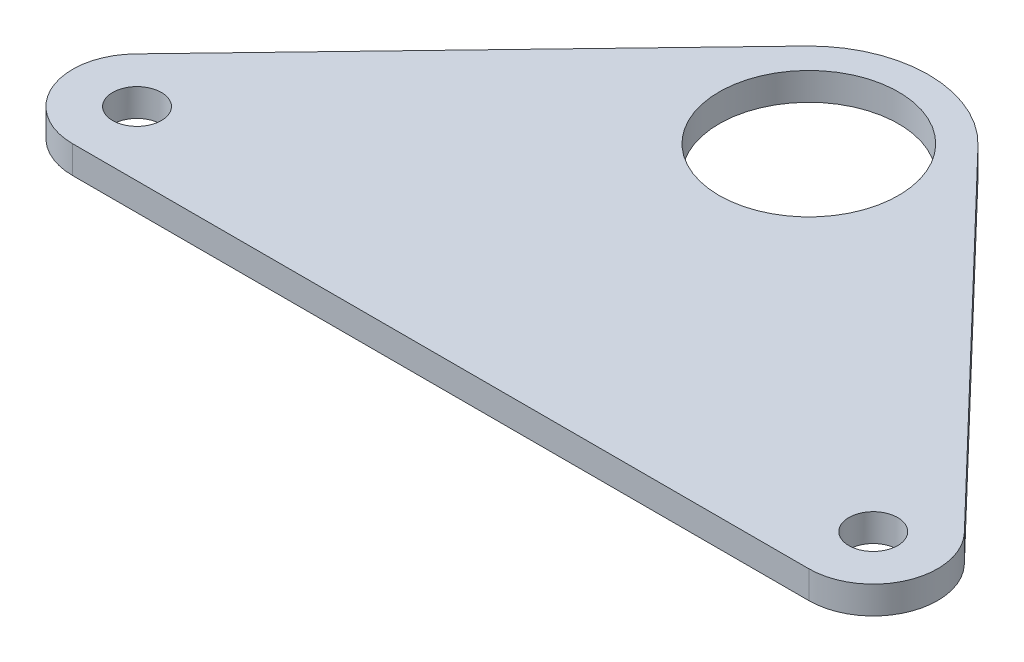
ISO-10303-21;
HEADER;
FILE_DESCRIPTION(('STEP AP214'),'2;1');
FILE_NAME('part.step','',(''),(''),'','','');
FILE_SCHEMA(('AUTOMOTIVE_DESIGN { 1 0 10303 214 1 1 1 1 }'));
ENDSEC;
DATA;
#1=APPLICATION_CONTEXT('core data for automotive mechanical design processes');
#2=APPLICATION_PROTOCOL_DEFINITION('international standard','automotive_design',2000,#1);
#3=PRODUCT_CONTEXT('',#1,'mechanical');
#4=PRODUCT('Part','Part','',(#3));
#5=PRODUCT_RELATED_PRODUCT_CATEGORY('part','',(#4));
#6=PRODUCT_DEFINITION_FORMATION('','',#4);
#7=PRODUCT_DEFINITION_CONTEXT('part definition',#1,'design');
#8=PRODUCT_DEFINITION('design','',#6,#7);
#9=PRODUCT_DEFINITION_SHAPE('','',#8);
#10=(LENGTH_UNIT() NAMED_UNIT(*) SI_UNIT(.MILLI.,.METRE.));
#11=(NAMED_UNIT(*) PLANE_ANGLE_UNIT() SI_UNIT($,.RADIAN.));
#12=(NAMED_UNIT(*) SI_UNIT($,.STERADIAN.) SOLID_ANGLE_UNIT());
#13=UNCERTAINTY_MEASURE_WITH_UNIT(LENGTH_MEASURE(1.E-05),#10,'distance_accuracy_value','');
#14=(GEOMETRIC_REPRESENTATION_CONTEXT(3) GLOBAL_UNCERTAINTY_ASSIGNED_CONTEXT((#13)) GLOBAL_UNIT_ASSIGNED_CONTEXT((#10,
#11,#12)) REPRESENTATION_CONTEXT('',''));
#15=CARTESIAN_POINT('',(0.,0.,0.));
#16=DIRECTION('',(0.,0.,1.));
#17=DIRECTION('',(1.,0.,0.));
#18=AXIS2_PLACEMENT_3D('',#15,#16,#17);
#19=CARTESIAN_POINT('',(0.,3.,0.));
#20=DIRECTION('',(0.,-1.,0.));
#21=DIRECTION('',(0.,0.,-1.));
#22=AXIS2_PLACEMENT_3D('',#19,#20,#21);
#23=PLANE('',#22);
#24=CARTESIAN_POINT('',(-40.,3.,33.));
#25=DIRECTION('',(0.,1.,0.));
#26=DIRECTION('',(0.,0.,1.));
#27=AXIS2_PLACEMENT_3D('',#24,#25,#26);
#28=CIRCLE('',#27,2.64999999999999);
#29=CARTESIAN_POINT('',(-40.,3.,35.65));
#30=VERTEX_POINT('',#29);
#31=EDGE_CURVE('E201',#30,#30,#28,.T.);
#32=ORIENTED_EDGE('',*,*,#31,.F.);
#33=EDGE_LOOP('',(#32));
#34=FACE_BOUND('',#33,.T.);
#35=CARTESIAN_POINT('',(40.,3.,33.));
#36=DIRECTION('',(0.,1.,0.));
#37=DIRECTION('',(0.,0.,1.));
#38=AXIS2_PLACEMENT_3D('',#35,#36,#37);
#39=CIRCLE('',#38,2.64999999999999);
#40=CARTESIAN_POINT('',(40.,3.,35.65));
#41=VERTEX_POINT('',#40);
#42=EDGE_CURVE('E206',#41,#41,#39,.T.);
#43=ORIENTED_EDGE('',*,*,#42,.F.);
#44=EDGE_LOOP('',(#43));
#45=FACE_BOUND('',#44,.T.);
#46=CARTESIAN_POINT('',(0.,3.,0.));
#47=DIRECTION('',(0.,1.,0.));
#48=DIRECTION('',(0.,0.,-1.));
#49=AXIS2_PLACEMENT_3D('',#46,#47,#48);
#50=CIRCLE('',#49,13.);
#51=CARTESIAN_POINT('',(9.37769563614869,3.,-9.003267437756));
#52=VERTEX_POINT('',#51);
#53=CARTESIAN_POINT('',(-9.3776956361487,3.,-9.003267437756));
#54=VERTEX_POINT('',#53);
#55=EDGE_CURVE('E149',#52,#54,#50,.T.);
#56=ORIENTED_EDGE('',*,*,#55,.T.);
#57=DIRECTION('',(-0.692559033673539,0.,0.72136120278067));
#58=VECTOR('',#57,1.);
#59=CARTESIAN_POINT('',(-9.3776956361487,3.,-9.003267437756));
#60=LINE('',#59,#58);
#61=CARTESIAN_POINT('',(-45.0495284194647,3.,28.1520867642852));
#62=VERTEX_POINT('',#61);
#63=EDGE_CURVE('E96',#54,#62,#60,.T.);
#64=ORIENTED_EDGE('',*,*,#63,.T.);
#65=CARTESIAN_POINT('',(-40.,3.,33.));
#66=DIRECTION('',(0.,1.,0.));
#67=DIRECTION('',(0.,0.,1.));
#68=AXIS2_PLACEMENT_3D('',#65,#66,#67);
#69=CIRCLE('',#68,6.99999999999999);
#70=CARTESIAN_POINT('',(-40.,3.,40.));
#71=VERTEX_POINT('',#70);
#72=EDGE_CURVE('E109',#62,#71,#69,.T.);
#73=ORIENTED_EDGE('',*,*,#72,.T.);
#74=DIRECTION('',(1.,0.,0.));
#75=VECTOR('',#74,1.);
#76=CARTESIAN_POINT('',(-40.,3.,40.));
#77=LINE('',#76,#75);
#78=CARTESIAN_POINT('',(40.,3.,40.));
#79=VERTEX_POINT('',#78);
#80=EDGE_CURVE('E103',#71,#79,#77,.T.);
#81=ORIENTED_EDGE('',*,*,#80,.T.);
#82=CARTESIAN_POINT('',(40.,3.,33.));
#83=DIRECTION('',(0.,1.,0.));
#84=DIRECTION('',(0.,0.,1.));
#85=AXIS2_PLACEMENT_3D('',#82,#83,#84);
#86=CIRCLE('',#85,6.99999999999999);
#87=CARTESIAN_POINT('',(45.0495284194647,3.,28.1520867642852));
#88=VERTEX_POINT('',#87);
#89=EDGE_CURVE('E107',#79,#88,#86,.T.);
#90=ORIENTED_EDGE('',*,*,#89,.T.);
#91=DIRECTION('',(-0.692559033673539,0.,-0.72136120278067));
#92=VECTOR('',#91,1.);
#93=CARTESIAN_POINT('',(45.0495284194647,3.,28.1520867642852));
#94=LINE('',#93,#92);
#95=EDGE_CURVE('E59',#88,#52,#94,.T.);
#96=ORIENTED_EDGE('',*,*,#95,.T.);
#97=EDGE_LOOP('',(#56,#64,#73,#81,#90,#96));
#98=FACE_BOUND('',#97,.T.);
#99=CARTESIAN_POINT('',(0.,3.,0.));
#100=DIRECTION('',(0.,1.,0.));
#101=DIRECTION('',(0.,0.,1.));
#102=AXIS2_PLACEMENT_3D('',#99,#100,#101);
#103=CIRCLE('',#102,9.75);
#104=CARTESIAN_POINT('',(0.,3.,9.75));
#105=VERTEX_POINT('',#104);
#106=EDGE_CURVE('E137',#105,#105,#103,.T.);
#107=ORIENTED_EDGE('',*,*,#106,.F.);
#108=EDGE_LOOP('',(#107));
#109=FACE_BOUND('',#108,.T.);
#110=ADVANCED_FACE('F41',(#34,#45,#98,#109),#23,.F.);
#111=CARTESIAN_POINT('',(0.,0.,0.));
#112=DIRECTION('',(0.,-1.,0.));
#113=DIRECTION('',(0.,0.,-1.));
#114=AXIS2_PLACEMENT_3D('',#111,#112,#113);
#115=PLANE('',#114);
#116=CARTESIAN_POINT('',(-40.,0.,33.));
#117=DIRECTION('',(0.,-1.,0.));
#118=DIRECTION('',(0.,0.,-1.));
#119=AXIS2_PLACEMENT_3D('',#116,#117,#118);
#120=CIRCLE('',#119,2.64999999999999);
#121=CARTESIAN_POINT('',(-40.,0.,30.35));
#122=VERTEX_POINT('',#121);
#123=EDGE_CURVE('E204',#122,#122,#120,.T.);
#124=ORIENTED_EDGE('',*,*,#123,.F.);
#125=EDGE_LOOP('',(#124));
#126=FACE_BOUND('',#125,.T.);
#127=CARTESIAN_POINT('',(40.,0.,33.));
#128=DIRECTION('',(0.,-1.,0.));
#129=DIRECTION('',(0.,0.,-1.));
#130=AXIS2_PLACEMENT_3D('',#127,#128,#129);
#131=CIRCLE('',#130,2.64999999999999);
#132=CARTESIAN_POINT('',(40.,0.,30.35));
#133=VERTEX_POINT('',#132);
#134=EDGE_CURVE('E210',#133,#133,#131,.T.);
#135=ORIENTED_EDGE('',*,*,#134,.F.);
#136=EDGE_LOOP('',(#135));
#137=FACE_BOUND('',#136,.T.);
#138=CARTESIAN_POINT('',(0.,0.,0.));
#139=DIRECTION('',(0.,1.,0.));
#140=DIRECTION('',(0.,0.,-1.));
#141=AXIS2_PLACEMENT_3D('',#138,#139,#140);
#142=CIRCLE('',#141,13.);
#143=CARTESIAN_POINT('',(9.37769563614869,0.,-9.003267437756));
#144=VERTEX_POINT('',#143);
#145=CARTESIAN_POINT('',(-9.3776956361487,0.,-9.003267437756));
#146=VERTEX_POINT('',#145);
#147=EDGE_CURVE('E133',#144,#146,#142,.T.);
#148=ORIENTED_EDGE('',*,*,#147,.F.);
#149=DIRECTION('',(-0.692559033673539,0.,-0.72136120278067));
#150=VECTOR('',#149,1.);
#151=CARTESIAN_POINT('',(45.0495284194647,0.,28.1520867642852));
#152=LINE('',#151,#150);
#153=CARTESIAN_POINT('',(45.0495284194647,0.,28.1520867642852));
#154=VERTEX_POINT('',#153);
#155=EDGE_CURVE('E88',#154,#144,#152,.T.);
#156=ORIENTED_EDGE('',*,*,#155,.F.);
#157=CARTESIAN_POINT('',(40.,0.,33.));
#158=DIRECTION('',(0.,1.,0.));
#159=DIRECTION('',(0.,0.,1.));
#160=AXIS2_PLACEMENT_3D('',#157,#158,#159);
#161=CIRCLE('',#160,6.99999999999999);
#162=CARTESIAN_POINT('',(40.,0.,40.));
#163=VERTEX_POINT('',#162);
#164=EDGE_CURVE('E82',#163,#154,#161,.T.);
#165=ORIENTED_EDGE('',*,*,#164,.F.);
#166=DIRECTION('',(1.,0.,0.));
#167=VECTOR('',#166,1.);
#168=CARTESIAN_POINT('',(-40.,0.,40.));
#169=LINE('',#168,#167);
#170=CARTESIAN_POINT('',(-40.,0.,40.));
#171=VERTEX_POINT('',#170);
#172=EDGE_CURVE('E118',#171,#163,#169,.T.);
#173=ORIENTED_EDGE('',*,*,#172,.F.);
#174=CARTESIAN_POINT('',(-40.,0.,33.));
#175=DIRECTION('',(0.,1.,0.));
#176=DIRECTION('',(0.,0.,1.));
#177=AXIS2_PLACEMENT_3D('',#174,#175,#176);
#178=CIRCLE('',#177,6.99999999999999);
#179=CARTESIAN_POINT('',(-45.0495284194647,0.,28.1520867642852));
#180=VERTEX_POINT('',#179);
#181=EDGE_CURVE('E140',#180,#171,#178,.T.);
#182=ORIENTED_EDGE('',*,*,#181,.F.);
#183=DIRECTION('',(-0.692559033673539,0.,0.72136120278067));
#184=VECTOR('',#183,1.);
#185=CARTESIAN_POINT('',(-9.3776956361487,0.,-9.003267437756));
#186=LINE('',#185,#184);
#187=EDGE_CURVE('E136',#146,#180,#186,.T.);
#188=ORIENTED_EDGE('',*,*,#187,.F.);
#189=EDGE_LOOP('',(#148,#156,#165,#173,#182,#188));
#190=FACE_BOUND('',#189,.T.);
#191=CARTESIAN_POINT('',(0.,0.,0.));
#192=DIRECTION('',(0.,1.,0.));
#193=DIRECTION('',(0.,0.,1.));
#194=AXIS2_PLACEMENT_3D('',#191,#192,#193);
#195=CIRCLE('',#194,9.75);
#196=CARTESIAN_POINT('',(0.,0.,9.75));
#197=VERTEX_POINT('',#196);
#198=EDGE_CURVE('E217',#197,#197,#195,.T.);
#199=ORIENTED_EDGE('',*,*,#198,.T.);
#200=EDGE_LOOP('',(#199));
#201=FACE_BOUND('',#200,.T.);
#202=ADVANCED_FACE('F163',(#126,#137,#190,#201),#115,.T.);
#203=CARTESIAN_POINT('',(0.,3.,0.));
#204=DIRECTION('',(0.,-1.,0.));
#205=DIRECTION('',(0.,0.,-1.));
#206=AXIS2_PLACEMENT_3D('',#203,#204,#205);
#207=CYLINDRICAL_SURFACE('',#206,13.);
#208=ORIENTED_EDGE('',*,*,#147,.T.);
#209=DIRECTION('',(0.,-1.,0.));
#210=VECTOR('',#209,1.);
#211=CARTESIAN_POINT('',(-9.3776956361487,3.,-9.003267437756));
#212=LINE('',#211,#210);
#213=EDGE_CURVE('E11',#54,#146,#212,.T.);
#214=ORIENTED_EDGE('',*,*,#213,.F.);
#215=ORIENTED_EDGE('',*,*,#55,.F.);
#216=DIRECTION('',(0.,-1.,0.));
#217=VECTOR('',#216,1.);
#218=CARTESIAN_POINT('',(9.37769563614869,3.,-9.003267437756));
#219=LINE('',#218,#217);
#220=EDGE_CURVE('E129',#52,#144,#219,.T.);
#221=ORIENTED_EDGE('',*,*,#220,.T.);
#222=EDGE_LOOP('',(#208,#214,#215,#221));
#223=FACE_BOUND('',#222,.T.);
#224=ADVANCED_FACE('F43',(#223),#207,.T.);
#225=CARTESIAN_POINT('',(-9.3776956361487,3.,-9.003267437756));
#226=DIRECTION('',(0.72136120278067,0.,0.692559033673539));
#227=DIRECTION('',(0.692559033673539,0.,-0.72136120278067));
#228=AXIS2_PLACEMENT_3D('',#225,#226,#227);
#229=PLANE('',#228);
#230=ORIENTED_EDGE('',*,*,#187,.T.);
#231=DIRECTION('',(0.,-1.,0.));
#232=VECTOR('',#231,1.);
#233=CARTESIAN_POINT('',(-45.0495284194647,3.,28.1520867642852));
#234=LINE('',#233,#232);
#235=EDGE_CURVE('E51',#62,#180,#234,.T.);
#236=ORIENTED_EDGE('',*,*,#235,.F.);
#237=ORIENTED_EDGE('',*,*,#63,.F.);
#238=ORIENTED_EDGE('',*,*,#213,.T.);
#239=EDGE_LOOP('',(#230,#236,#237,#238));
#240=FACE_BOUND('',#239,.T.);
#241=ADVANCED_FACE('F263',(#240),#229,.F.);
#242=CARTESIAN_POINT('',(-40.,3.,33.));
#243=DIRECTION('',(0.,-1.,0.));
#244=DIRECTION('',(0.,0.,-1.));
#245=AXIS2_PLACEMENT_3D('',#242,#243,#244);
#246=CYLINDRICAL_SURFACE('',#245,6.99999999999999);
#247=ORIENTED_EDGE('',*,*,#181,.T.);
#248=DIRECTION('',(0.,-1.,0.));
#249=VECTOR('',#248,1.);
#250=CARTESIAN_POINT('',(-40.,3.,40.));
#251=LINE('',#250,#249);
#252=EDGE_CURVE('E120',#71,#171,#251,.T.);
#253=ORIENTED_EDGE('',*,*,#252,.F.);
#254=ORIENTED_EDGE('',*,*,#72,.F.);
#255=ORIENTED_EDGE('',*,*,#235,.T.);
#256=EDGE_LOOP('',(#247,#253,#254,#255));
#257=FACE_BOUND('',#256,.T.);
#258=ADVANCED_FACE('F160',(#257),#246,.T.);
#259=CARTESIAN_POINT('',(-40.,3.,40.));
#260=DIRECTION('',(0.,0.,-1.));
#261=DIRECTION('',(-1.,0.,0.));
#262=AXIS2_PLACEMENT_3D('',#259,#260,#261);
#263=PLANE('',#262);
#264=ORIENTED_EDGE('',*,*,#172,.T.);
#265=DIRECTION('',(0.,-1.,0.));
#266=VECTOR('',#265,1.);
#267=CARTESIAN_POINT('',(40.,3.,40.));
#268=LINE('',#267,#266);
#269=EDGE_CURVE('E115',#79,#163,#268,.T.);
#270=ORIENTED_EDGE('',*,*,#269,.F.);
#271=ORIENTED_EDGE('',*,*,#80,.F.);
#272=ORIENTED_EDGE('',*,*,#252,.T.);
#273=EDGE_LOOP('',(#264,#270,#271,#272));
#274=FACE_BOUND('',#273,.T.);
#275=ADVANCED_FACE('F116',(#274),#263,.F.);
#276=CARTESIAN_POINT('',(40.,3.,33.));
#277=DIRECTION('',(0.,-1.,0.));
#278=DIRECTION('',(0.,0.,-1.));
#279=AXIS2_PLACEMENT_3D('',#276,#277,#278);
#280=CYLINDRICAL_SURFACE('',#279,6.99999999999999);
#281=ORIENTED_EDGE('',*,*,#164,.T.);
#282=DIRECTION('',(0.,-1.,0.));
#283=VECTOR('',#282,1.);
#284=CARTESIAN_POINT('',(45.0495284194647,3.,28.1520867642852));
#285=LINE('',#284,#283);
#286=EDGE_CURVE('E121',#88,#154,#285,.T.);
#287=ORIENTED_EDGE('',*,*,#286,.F.);
#288=ORIENTED_EDGE('',*,*,#89,.F.);
#289=ORIENTED_EDGE('',*,*,#269,.T.);
#290=EDGE_LOOP('',(#281,#287,#288,#289));
#291=FACE_BOUND('',#290,.T.);
#292=ADVANCED_FACE('F123',(#291),#280,.T.);
#293=CARTESIAN_POINT('',(45.0495284194647,3.,28.1520867642852));
#294=DIRECTION('',(-0.721361202780669,0.,0.692559033673539));
#295=DIRECTION('',(0.692559033673539,0.,0.721361202780669));
#296=AXIS2_PLACEMENT_3D('',#293,#294,#295);
#297=PLANE('',#296);
#298=ORIENTED_EDGE('',*,*,#155,.T.);
#299=ORIENTED_EDGE('',*,*,#220,.F.);
#300=ORIENTED_EDGE('',*,*,#95,.F.);
#301=ORIENTED_EDGE('',*,*,#286,.T.);
#302=EDGE_LOOP('',(#298,#299,#300,#301));
#303=FACE_BOUND('',#302,.T.);
#304=ADVANCED_FACE('F168',(#303),#297,.F.);
#305=CARTESIAN_POINT('',(0.,3.,0.));
#306=DIRECTION('',(0.,-1.,0.));
#307=DIRECTION('',(0.,0.,-1.));
#308=AXIS2_PLACEMENT_3D('',#305,#306,#307);
#309=CYLINDRICAL_SURFACE('',#308,9.75);
#310=ORIENTED_EDGE('',*,*,#106,.T.);
#311=EDGE_LOOP('',(#310));
#312=FACE_BOUND('',#311,.T.);
#313=ORIENTED_EDGE('',*,*,#198,.F.);
#314=EDGE_LOOP('',(#313));
#315=FACE_BOUND('',#314,.T.);
#316=ADVANCED_FACE('F170',(#312,#315),#309,.F.);
#317=CARTESIAN_POINT('',(40.,3.,33.));
#318=DIRECTION('',(0.,1.,0.));
#319=DIRECTION('',(0.,0.,1.));
#320=AXIS2_PLACEMENT_3D('',#317,#318,#319);
#321=CYLINDRICAL_SURFACE('',#320,2.64999999999999);
#322=ORIENTED_EDGE('',*,*,#42,.T.);
#323=EDGE_LOOP('',(#322));
#324=FACE_BOUND('',#323,.T.);
#325=ORIENTED_EDGE('',*,*,#134,.T.);
#326=EDGE_LOOP('',(#325));
#327=FACE_BOUND('',#326,.T.);
#328=ADVANCED_FACE('F176',(#324,#327),#321,.F.);
#329=CARTESIAN_POINT('',(-40.,3.,33.));
#330=DIRECTION('',(0.,1.,0.));
#331=DIRECTION('',(0.,0.,1.));
#332=AXIS2_PLACEMENT_3D('',#329,#330,#331);
#333=CYLINDRICAL_SURFACE('',#332,2.64999999999999);
#334=ORIENTED_EDGE('',*,*,#31,.T.);
#335=EDGE_LOOP('',(#334));
#336=FACE_BOUND('',#335,.T.);
#337=ORIENTED_EDGE('',*,*,#123,.T.);
#338=EDGE_LOOP('',(#337));
#339=FACE_BOUND('',#338,.T.);
#340=ADVANCED_FACE('F193',(#336,#339),#333,.F.);
#341=CLOSED_SHELL('',(#110,#202,#224,#241,#258,#275,#292,#304,#316,#328,#340));
#342=MANIFOLD_SOLID_BREP('B2',#341);
#343=ADVANCED_BREP_SHAPE_REPRESENTATION('',(#18,#342),#14);
#344=SHAPE_DEFINITION_REPRESENTATION(#9,#343);
ENDSEC;
END-ISO-10303-21;
